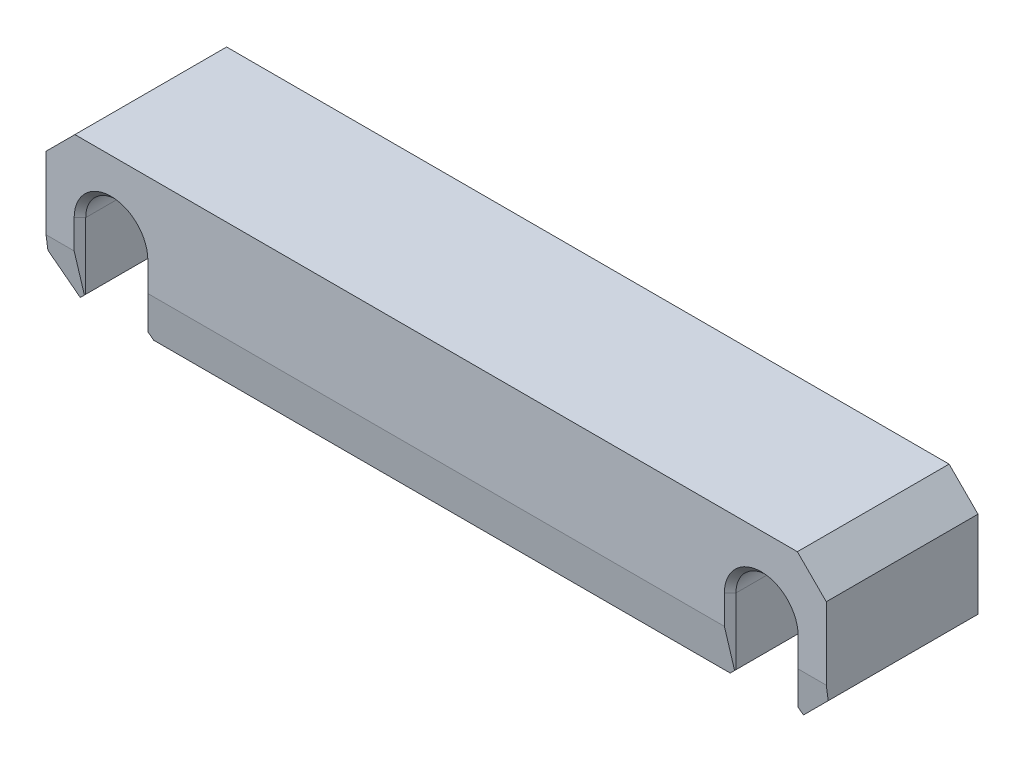
ISO-10303-21;
HEADER;
FILE_DESCRIPTION(('STEP AP214'),'2;1');
FILE_NAME('part.step','',(''),(''),'','','');
FILE_SCHEMA(('AUTOMOTIVE_DESIGN { 1 0 10303 214 1 1 1 1 }'));
ENDSEC;
DATA;
#1=APPLICATION_CONTEXT('core data for automotive mechanical design processes');
#2=APPLICATION_PROTOCOL_DEFINITION('international standard','automotive_design',2000,#1);
#3=PRODUCT_CONTEXT('',#1,'mechanical');
#4=PRODUCT('Part','Part','',(#3));
#5=PRODUCT_RELATED_PRODUCT_CATEGORY('part','',(#4));
#6=PRODUCT_DEFINITION_FORMATION('','',#4);
#7=PRODUCT_DEFINITION_CONTEXT('part definition',#1,'design');
#8=PRODUCT_DEFINITION('design','',#6,#7);
#9=PRODUCT_DEFINITION_SHAPE('','',#8);
#10=(LENGTH_UNIT() NAMED_UNIT(*) SI_UNIT(.MILLI.,.METRE.));
#11=(NAMED_UNIT(*) PLANE_ANGLE_UNIT() SI_UNIT($,.RADIAN.));
#12=(NAMED_UNIT(*) SI_UNIT($,.STERADIAN.) SOLID_ANGLE_UNIT());
#13=UNCERTAINTY_MEASURE_WITH_UNIT(LENGTH_MEASURE(1.E-05),#10,'distance_accuracy_value','');
#14=(GEOMETRIC_REPRESENTATION_CONTEXT(3) GLOBAL_UNCERTAINTY_ASSIGNED_CONTEXT((#13)) GLOBAL_UNIT_ASSIGNED_CONTEXT((#10,
#11,#12)) REPRESENTATION_CONTEXT('',''));
#15=CARTESIAN_POINT('',(0.,0.,0.));
#16=DIRECTION('',(0.,0.,1.));
#17=DIRECTION('',(1.,0.,0.));
#18=AXIS2_PLACEMENT_3D('',#15,#16,#17);
#19=CARTESIAN_POINT('',(0.,0.,10.5));
#20=DIRECTION('',(0.,1.,0.));
#21=DIRECTION('',(0.,0.,1.));
#22=AXIS2_PLACEMENT_3D('',#19,#20,#21);
#23=PLANE('',#22);
#24=DIRECTION('',(1.,0.,0.));
#25=VECTOR('',#24,1.);
#26=CARTESIAN_POINT('',(0.,0.,0.));
#27=LINE('',#26,#25);
#28=CARTESIAN_POINT('',(7.04999999999997,0.,0.));
#29=VERTEX_POINT('',#28);
#30=CARTESIAN_POINT('',(46.95,0.,0.));
#31=VERTEX_POINT('',#30);
#32=EDGE_CURVE('E259',#29,#31,#27,.T.);
#33=ORIENTED_EDGE('',*,*,#32,.T.);
#34=DIRECTION('',(0.,0.,1.));
#35=VECTOR('',#34,1.);
#36=CARTESIAN_POINT('',(46.95,0.,10.5));
#37=LINE('',#36,#35);
#38=CARTESIAN_POINT('',(46.95,0.,10.1));
#39=VERTEX_POINT('',#38);
#40=EDGE_CURVE('E418',#31,#39,#37,.T.);
#41=ORIENTED_EDGE('',*,*,#40,.T.);
#42=DIRECTION('',(-1.,0.,0.));
#43=VECTOR('',#42,1.);
#44=CARTESIAN_POINT('',(0.,0.,10.1));
#45=LINE('',#44,#43);
#46=CARTESIAN_POINT('',(7.05,0.,10.1));
#47=VERTEX_POINT('',#46);
#48=EDGE_CURVE('E239',#39,#47,#45,.T.);
#49=ORIENTED_EDGE('',*,*,#48,.T.);
#50=DIRECTION('',(0.,0.,-1.));
#51=VECTOR('',#50,1.);
#52=CARTESIAN_POINT('',(7.05,0.,10.5));
#53=LINE('',#52,#51);
#54=EDGE_CURVE('E416',#47,#29,#53,.T.);
#55=ORIENTED_EDGE('',*,*,#54,.T.);
#56=EDGE_LOOP('',(#33,#41,#49,#55));
#57=FACE_BOUND('',#56,.T.);
#58=ADVANCED_FACE('F32',(#57),#23,.F.);
#59=CARTESIAN_POINT('',(0.,0.,10.5));
#60=DIRECTION('',(1.,0.,0.));
#61=DIRECTION('',(0.,0.,-1.));
#62=AXIS2_PLACEMENT_3D('',#59,#60,#61);
#63=PLANE('',#62);
#64=DIRECTION('',(0.,-1.,0.));
#65=VECTOR('',#64,1.);
#66=CARTESIAN_POINT('',(0.,0.,0.));
#67=LINE('',#66,#65);
#68=CARTESIAN_POINT('',(0.,8.,0.));
#69=VERTEX_POINT('',#68);
#70=CARTESIAN_POINT('',(0.,2.00000000000001,0.));
#71=VERTEX_POINT('',#70);
#72=EDGE_CURVE('E256',#69,#71,#67,.T.);
#73=ORIENTED_EDGE('',*,*,#72,.T.);
#74=DIRECTION('',(0.,0.,1.));
#75=VECTOR('',#74,1.);
#76=CARTESIAN_POINT('',(0.,2.00000000000001,10.5));
#77=LINE('',#76,#75);
#78=CARTESIAN_POINT('',(0.,2.00000000000001,10.3666666666667));
#79=VERTEX_POINT('',#78);
#80=EDGE_CURVE('E299',#71,#79,#77,.T.);
#81=ORIENTED_EDGE('',*,*,#80,.T.);
#82=DIRECTION('',(0.,-0.991227900682635,-0.132163720091014));
#83=VECTOR('',#82,1.);
#84=CARTESIAN_POINT('',(0.,3.00000000000008,10.5));
#85=LINE('',#84,#83);
#86=CARTESIAN_POINT('',(0.,3.00000000000008,10.5));
#87=VERTEX_POINT('',#86);
#88=EDGE_CURVE('E240',#79,#87,#85,.F.);
#89=ORIENTED_EDGE('',*,*,#88,.T.);
#90=DIRECTION('',(0.,-1.,0.));
#91=VECTOR('',#90,1.);
#92=CARTESIAN_POINT('',(0.,0.,10.5));
#93=LINE('',#92,#91);
#94=CARTESIAN_POINT('',(0.,8.,10.5));
#95=VERTEX_POINT('',#94);
#96=EDGE_CURVE('E247',#95,#87,#93,.T.);
#97=ORIENTED_EDGE('',*,*,#96,.F.);
#98=DIRECTION('',(0.,0.,-1.));
#99=VECTOR('',#98,1.);
#100=CARTESIAN_POINT('',(0.,8.,10.5));
#101=LINE('',#100,#99);
#102=EDGE_CURVE('E296',#95,#69,#101,.T.);
#103=ORIENTED_EDGE('',*,*,#102,.T.);
#104=EDGE_LOOP('',(#73,#81,#89,#97,#103));
#105=FACE_BOUND('',#104,.T.);
#106=ADVANCED_FACE('F484',(#105),#63,.F.);
#107=CARTESIAN_POINT('',(54.,0.,10.5));
#108=DIRECTION('',(-1.,0.,0.));
#109=DIRECTION('',(0.,0.,1.));
#110=AXIS2_PLACEMENT_3D('',#107,#108,#109);
#111=PLANE('',#110);
#112=DIRECTION('',(0.,0.991227900682635,0.132163720091014));
#113=VECTOR('',#112,1.);
#114=CARTESIAN_POINT('',(54.,3.00000000000008,10.5));
#115=LINE('',#114,#113);
#116=CARTESIAN_POINT('',(54.,3.00000000000008,10.5));
#117=VERTEX_POINT('',#116);
#118=CARTESIAN_POINT('',(54.,2.,10.3666666666667));
#119=VERTEX_POINT('',#118);
#120=EDGE_CURVE('E232',#117,#119,#115,.F.);
#121=ORIENTED_EDGE('',*,*,#120,.T.);
#122=DIRECTION('',(0.,0.,-1.));
#123=VECTOR('',#122,1.);
#124=CARTESIAN_POINT('',(54.,2.,10.5));
#125=LINE('',#124,#123);
#126=CARTESIAN_POINT('',(54.,2.,0.));
#127=VERTEX_POINT('',#126);
#128=EDGE_CURVE('E275',#119,#127,#125,.T.);
#129=ORIENTED_EDGE('',*,*,#128,.T.);
#130=DIRECTION('',(0.,1.,0.));
#131=VECTOR('',#130,1.);
#132=CARTESIAN_POINT('',(54.,0.,0.));
#133=LINE('',#132,#131);
#134=CARTESIAN_POINT('',(54.,7.99999999999998,0.));
#135=VERTEX_POINT('',#134);
#136=EDGE_CURVE('E263',#127,#135,#133,.T.);
#137=ORIENTED_EDGE('',*,*,#136,.T.);
#138=DIRECTION('',(0.,0.,1.));
#139=VECTOR('',#138,1.);
#140=CARTESIAN_POINT('',(54.,7.99999999999998,10.5));
#141=LINE('',#140,#139);
#142=CARTESIAN_POINT('',(54.,7.99999999999998,10.5));
#143=VERTEX_POINT('',#142);
#144=EDGE_CURVE('E245',#135,#143,#141,.T.);
#145=ORIENTED_EDGE('',*,*,#144,.T.);
#146=DIRECTION('',(0.,1.,0.));
#147=VECTOR('',#146,1.);
#148=CARTESIAN_POINT('',(54.,0.,10.5));
#149=LINE('',#148,#147);
#150=EDGE_CURVE('E221',#117,#143,#149,.T.);
#151=ORIENTED_EDGE('',*,*,#150,.F.);
#152=EDGE_LOOP('',(#121,#129,#137,#145,#151));
#153=FACE_BOUND('',#152,.T.);
#154=ADVANCED_FACE('F242',(#153),#111,.F.);
#155=CARTESIAN_POINT('',(0.,10.,10.5));
#156=DIRECTION('',(0.,-1.,0.));
#157=DIRECTION('',(0.,0.,-1.));
#158=AXIS2_PLACEMENT_3D('',#155,#156,#157);
#159=PLANE('',#158);
#160=DIRECTION('',(-1.,0.,0.));
#161=VECTOR('',#160,1.);
#162=CARTESIAN_POINT('',(0.,10.,10.5));
#163=LINE('',#162,#161);
#164=CARTESIAN_POINT('',(52.,10.,10.5));
#165=VERTEX_POINT('',#164);
#166=CARTESIAN_POINT('',(2.00000000000001,10.,10.5));
#167=VERTEX_POINT('',#166);
#168=EDGE_CURVE('E246',#165,#167,#163,.T.);
#169=ORIENTED_EDGE('',*,*,#168,.F.);
#170=DIRECTION('',(0.,0.,-1.));
#171=VECTOR('',#170,1.);
#172=CARTESIAN_POINT('',(52.,10.,10.5));
#173=LINE('',#172,#171);
#174=CARTESIAN_POINT('',(52.,10.,0.));
#175=VERTEX_POINT('',#174);
#176=EDGE_CURVE('E289',#165,#175,#173,.T.);
#177=ORIENTED_EDGE('',*,*,#176,.T.);
#178=DIRECTION('',(-1.,0.,0.));
#179=VECTOR('',#178,1.);
#180=CARTESIAN_POINT('',(0.,10.,0.));
#181=LINE('',#180,#179);
#182=CARTESIAN_POINT('',(2.00000000000001,10.,0.));
#183=VERTEX_POINT('',#182);
#184=EDGE_CURVE('E252',#175,#183,#181,.T.);
#185=ORIENTED_EDGE('',*,*,#184,.T.);
#186=DIRECTION('',(0.,0.,1.));
#187=VECTOR('',#186,1.);
#188=CARTESIAN_POINT('',(2.00000000000001,10.,10.5));
#189=LINE('',#188,#187);
#190=EDGE_CURVE('E287',#183,#167,#189,.T.);
#191=ORIENTED_EDGE('',*,*,#190,.T.);
#192=EDGE_LOOP('',(#169,#177,#185,#191));
#193=FACE_BOUND('',#192,.T.);
#194=ADVANCED_FACE('F492',(#193),#159,.F.);
#195=CARTESIAN_POINT('',(0.,0.,10.5));
#196=DIRECTION('',(0.,0.,-1.));
#197=DIRECTION('',(-1.,0.,0.));
#198=AXIS2_PLACEMENT_3D('',#195,#196,#197);
#199=PLANE('',#198);
#200=CARTESIAN_POINT('',(49.5,5.,10.5));
#201=DIRECTION('',(0.,0.,-1.));
#202=DIRECTION('',(-1.,0.,0.));
#203=AXIS2_PLACEMENT_3D('',#200,#201,#202);
#204=CIRCLE('',#203,2.55000000000004);
#205=CARTESIAN_POINT('',(46.95,5.,10.5));
#206=VERTEX_POINT('',#205);
#207=CARTESIAN_POINT('',(52.05,5.,10.5));
#208=VERTEX_POINT('',#207);
#209=EDGE_CURVE('E341',#206,#208,#204,.T.);
#210=ORIENTED_EDGE('',*,*,#209,.T.);
#211=DIRECTION('',(0.,-1.,0.));
#212=VECTOR('',#211,1.);
#213=CARTESIAN_POINT('',(52.05,0.,10.5));
#214=LINE('',#213,#212);
#215=CARTESIAN_POINT('',(52.05,3.00000000000008,10.5));
#216=VERTEX_POINT('',#215);
#217=EDGE_CURVE('E224',#208,#216,#214,.T.);
#218=ORIENTED_EDGE('',*,*,#217,.T.);
#219=DIRECTION('',(1.,0.,0.));
#220=VECTOR('',#219,1.);
#221=CARTESIAN_POINT('',(0.,3.00000000000008,10.5));
#222=LINE('',#221,#220);
#223=EDGE_CURVE('E217',#216,#117,#222,.T.);
#224=ORIENTED_EDGE('',*,*,#223,.T.);
#225=ORIENTED_EDGE('',*,*,#150,.T.);
#226=DIRECTION('',(0.707106781186545,-0.70710678118655,0.));
#227=VECTOR('',#226,1.);
#228=CARTESIAN_POINT('',(52.,10.,10.5));
#229=LINE('',#228,#227);
#230=EDGE_CURVE('E294',#143,#165,#229,.F.);
#231=ORIENTED_EDGE('',*,*,#230,.T.);
#232=ORIENTED_EDGE('',*,*,#168,.T.);
#233=DIRECTION('',(0.70710678118655,0.707106781186545,0.));
#234=VECTOR('',#233,1.);
#235=CARTESIAN_POINT('',(0.,8.,10.5));
#236=LINE('',#235,#234);
#237=EDGE_CURVE('E292',#167,#95,#236,.F.);
#238=ORIENTED_EDGE('',*,*,#237,.T.);
#239=ORIENTED_EDGE('',*,*,#96,.T.);
#240=DIRECTION('',(1.,0.,0.));
#241=VECTOR('',#240,1.);
#242=CARTESIAN_POINT('',(0.,3.00000000000008,10.5));
#243=LINE('',#242,#241);
#244=CARTESIAN_POINT('',(1.94999999999996,3.00000000000008,10.5));
#245=VERTEX_POINT('',#244);
#246=EDGE_CURVE('E228',#87,#245,#243,.T.);
#247=ORIENTED_EDGE('',*,*,#246,.T.);
#248=DIRECTION('',(0.,1.,0.));
#249=VECTOR('',#248,1.);
#250=CARTESIAN_POINT('',(1.94999999999996,0.,10.5));
#251=LINE('',#250,#249);
#252=CARTESIAN_POINT('',(1.94999999999996,5.,10.5));
#253=VERTEX_POINT('',#252);
#254=EDGE_CURVE('E337',#245,#253,#251,.T.);
#255=ORIENTED_EDGE('',*,*,#254,.T.);
#256=CARTESIAN_POINT('',(4.5,5.,10.5));
#257=DIRECTION('',(0.,0.,-1.));
#258=DIRECTION('',(-1.,0.,0.));
#259=AXIS2_PLACEMENT_3D('',#256,#257,#258);
#260=CIRCLE('',#259,2.55000000000004);
#261=CARTESIAN_POINT('',(7.05000000000004,5.,10.5));
#262=VERTEX_POINT('',#261);
#263=EDGE_CURVE('E335',#253,#262,#260,.T.);
#264=ORIENTED_EDGE('',*,*,#263,.T.);
#265=DIRECTION('',(0.,-1.,0.));
#266=VECTOR('',#265,1.);
#267=CARTESIAN_POINT('',(7.05000000000004,0.,10.5));
#268=LINE('',#267,#266);
#269=CARTESIAN_POINT('',(7.05000000000004,3.00000000000008,10.5));
#270=VERTEX_POINT('',#269);
#271=EDGE_CURVE('E339',#262,#270,#268,.T.);
#272=ORIENTED_EDGE('',*,*,#271,.T.);
#273=DIRECTION('',(1.,0.,0.));
#274=VECTOR('',#273,1.);
#275=CARTESIAN_POINT('',(0.,3.00000000000008,10.5));
#276=LINE('',#275,#274);
#277=CARTESIAN_POINT('',(46.95,3.00000000000008,10.5));
#278=VERTEX_POINT('',#277);
#279=EDGE_CURVE('E229',#270,#278,#276,.T.);
#280=ORIENTED_EDGE('',*,*,#279,.T.);
#281=DIRECTION('',(0.,1.,0.));
#282=VECTOR('',#281,1.);
#283=CARTESIAN_POINT('',(46.95,0.,10.5));
#284=LINE('',#283,#282);
#285=EDGE_CURVE('E343',#278,#206,#284,.T.);
#286=ORIENTED_EDGE('',*,*,#285,.T.);
#287=EDGE_LOOP('',(#210,#218,#224,#225,#231,#232,#238,#239,#247,#255,#264,#272,#280,#286));
#288=FACE_BOUND('',#287,.T.);
#289=ADVANCED_FACE('F219',(#288),#199,.F.);
#290=CARTESIAN_POINT('',(0.,0.,0.));
#291=DIRECTION('',(0.,0.,-1.));
#292=DIRECTION('',(-1.,0.,0.));
#293=AXIS2_PLACEMENT_3D('',#290,#291,#292);
#294=PLANE('',#293);
#295=DIRECTION('',(0.70710678118655,0.707106781186545,0.));
#296=VECTOR('',#295,1.);
#297=CARTESIAN_POINT('',(25.9999999999998,-26.,0.));
#298=LINE('',#297,#296);
#299=CARTESIAN_POINT('',(52.05,0.0499999999999876,0.));
#300=VERTEX_POINT('',#299);
#301=EDGE_CURVE('E283',#127,#300,#298,.F.);
#302=ORIENTED_EDGE('',*,*,#301,.T.);
#303=DIRECTION('',(0.,1.,0.));
#304=VECTOR('',#303,1.);
#305=CARTESIAN_POINT('',(52.05,5.,0.));
#306=LINE('',#305,#304);
#307=CARTESIAN_POINT('',(52.05,5.,0.));
#308=VERTEX_POINT('',#307);
#309=EDGE_CURVE('E316',#300,#308,#306,.T.);
#310=ORIENTED_EDGE('',*,*,#309,.T.);
#311=CARTESIAN_POINT('',(49.5,5.,0.));
#312=DIRECTION('',(0.,0.,-1.));
#313=DIRECTION('',(-1.,0.,0.));
#314=AXIS2_PLACEMENT_3D('',#311,#312,#313);
#315=CIRCLE('',#314,2.54999999999997);
#316=CARTESIAN_POINT('',(46.95,5.,0.));
#317=VERTEX_POINT('',#316);
#318=EDGE_CURVE('E311',#308,#317,#315,.F.);
#319=ORIENTED_EDGE('',*,*,#318,.T.);
#320=DIRECTION('',(0.,-1.,0.));
#321=VECTOR('',#320,1.);
#322=CARTESIAN_POINT('',(46.95,0.,0.));
#323=LINE('',#322,#321);
#324=EDGE_CURVE('E313',#317,#31,#323,.T.);
#325=ORIENTED_EDGE('',*,*,#324,.T.);
#326=ORIENTED_EDGE('',*,*,#32,.F.);
#327=DIRECTION('',(0.,1.,0.));
#328=VECTOR('',#327,1.);
#329=CARTESIAN_POINT('',(7.04999999999997,5.,0.));
#330=LINE('',#329,#328);
#331=CARTESIAN_POINT('',(7.04999999999997,5.,0.));
#332=VERTEX_POINT('',#331);
#333=EDGE_CURVE('E308',#29,#332,#330,.T.);
#334=ORIENTED_EDGE('',*,*,#333,.T.);
#335=CARTESIAN_POINT('',(4.5,5.,0.));
#336=DIRECTION('',(0.,0.,-1.));
#337=DIRECTION('',(-1.,0.,0.));
#338=AXIS2_PLACEMENT_3D('',#335,#336,#337);
#339=CIRCLE('',#338,2.54999999999997);
#340=CARTESIAN_POINT('',(1.95000000000003,5.,0.));
#341=VERTEX_POINT('',#340);
#342=EDGE_CURVE('E304',#332,#341,#339,.F.);
#343=ORIENTED_EDGE('',*,*,#342,.T.);
#344=DIRECTION('',(0.,-1.,0.));
#345=VECTOR('',#344,1.);
#346=CARTESIAN_POINT('',(1.95000000000003,0.,0.));
#347=LINE('',#346,#345);
#348=CARTESIAN_POINT('',(1.95000000000003,0.0499999999999687,0.));
#349=VERTEX_POINT('',#348);
#350=EDGE_CURVE('E306',#341,#349,#347,.T.);
#351=ORIENTED_EDGE('',*,*,#350,.T.);
#352=DIRECTION('',(0.707106781186545,-0.70710678118655,0.));
#353=VECTOR('',#352,1.);
#354=CARTESIAN_POINT('',(1.00000000000001,1.,0.));
#355=LINE('',#354,#353);
#356=EDGE_CURVE('E279',#349,#71,#355,.F.);
#357=ORIENTED_EDGE('',*,*,#356,.T.);
#358=ORIENTED_EDGE('',*,*,#72,.F.);
#359=DIRECTION('',(-0.70710678118655,-0.707106781186545,0.));
#360=VECTOR('',#359,1.);
#361=CARTESIAN_POINT('',(-4.,4.00000000000002,0.));
#362=LINE('',#361,#360);
#363=EDGE_CURVE('E277',#69,#183,#362,.F.);
#364=ORIENTED_EDGE('',*,*,#363,.T.);
#365=ORIENTED_EDGE('',*,*,#184,.F.);
#366=DIRECTION('',(-0.707106781186545,0.70710678118655,0.));
#367=VECTOR('',#366,1.);
#368=CARTESIAN_POINT('',(31.0000000000002,31.,0.));
#369=LINE('',#368,#367);
#370=EDGE_CURVE('E281',#175,#135,#369,.F.);
#371=ORIENTED_EDGE('',*,*,#370,.T.);
#372=ORIENTED_EDGE('',*,*,#136,.F.);
#373=EDGE_LOOP('',(#302,#310,#319,#325,#326,#334,#343,#351,#357,#358,#364,#365,#371,#372));
#374=FACE_BOUND('',#373,.T.);
#375=ADVANCED_FACE('F446',(#374),#294,.T.);
#376=CARTESIAN_POINT('',(49.5,5.,0.));
#377=DIRECTION('',(0.,0.,1.));
#378=DIRECTION('',(1.,0.,0.));
#379=AXIS2_PLACEMENT_3D('',#376,#377,#378);
#380=CYLINDRICAL_SURFACE('',#379,2.15);
#381=DIRECTION('',(0.,0.,1.));
#382=VECTOR('',#381,1.);
#383=CARTESIAN_POINT('',(47.35,5.,0.));
#384=LINE('',#383,#382);
#385=CARTESIAN_POINT('',(47.35,5.,0.39999999999997));
#386=VERTEX_POINT('',#385);
#387=CARTESIAN_POINT('',(47.35,5.,10.1));
#388=VERTEX_POINT('',#387);
#389=EDGE_CURVE('E541',#386,#388,#384,.T.);
#390=ORIENTED_EDGE('',*,*,#389,.F.);
#391=CARTESIAN_POINT('',(49.5,5.,0.39999999999997));
#392=DIRECTION('',(0.,0.,-1.));
#393=DIRECTION('',(-1.,0.,0.));
#394=AXIS2_PLACEMENT_3D('',#391,#392,#393);
#395=CIRCLE('',#394,2.15);
#396=CARTESIAN_POINT('',(51.65,5.,0.39999999999997));
#397=VERTEX_POINT('',#396);
#398=EDGE_CURVE('E333',#386,#397,#395,.T.);
#399=ORIENTED_EDGE('',*,*,#398,.T.);
#400=DIRECTION('',(0.,0.,1.));
#401=VECTOR('',#400,1.);
#402=CARTESIAN_POINT('',(51.65,5.,0.));
#403=LINE('',#402,#401);
#404=CARTESIAN_POINT('',(51.65,5.,10.1));
#405=VERTEX_POINT('',#404);
#406=EDGE_CURVE('E378',#397,#405,#403,.T.);
#407=ORIENTED_EDGE('',*,*,#406,.T.);
#408=CARTESIAN_POINT('',(49.5,5.,10.1));
#409=DIRECTION('',(0.,0.,-1.));
#410=DIRECTION('',(-1.,0.,0.));
#411=AXIS2_PLACEMENT_3D('',#408,#409,#410);
#412=CIRCLE('',#411,2.15);
#413=EDGE_CURVE('E331',#405,#388,#412,.F.);
#414=ORIENTED_EDGE('',*,*,#413,.T.);
#415=EDGE_LOOP('',(#390,#399,#407,#414));
#416=FACE_BOUND('',#415,.T.);
#417=ADVANCED_FACE('F550',(#416),#380,.F.);
#418=CARTESIAN_POINT('',(4.5,5.,0.));
#419=DIRECTION('',(0.,0.,1.));
#420=DIRECTION('',(1.,0.,0.));
#421=AXIS2_PLACEMENT_3D('',#418,#419,#420);
#422=CYLINDRICAL_SURFACE('',#421,2.15);
#423=DIRECTION('',(0.,0.,1.));
#424=VECTOR('',#423,1.);
#425=CARTESIAN_POINT('',(2.35,5.,0.));
#426=LINE('',#425,#424);
#427=CARTESIAN_POINT('',(2.35,5.,0.399999999999971));
#428=VERTEX_POINT('',#427);
#429=CARTESIAN_POINT('',(2.35,5.,10.1));
#430=VERTEX_POINT('',#429);
#431=EDGE_CURVE('E260',#428,#430,#426,.T.);
#432=ORIENTED_EDGE('',*,*,#431,.F.);
#433=CARTESIAN_POINT('',(4.5,5.,0.399999999999971));
#434=DIRECTION('',(0.,0.,-1.));
#435=DIRECTION('',(-1.,0.,0.));
#436=AXIS2_PLACEMENT_3D('',#433,#434,#435);
#437=CIRCLE('',#436,2.15);
#438=CARTESIAN_POINT('',(6.65,5.,0.399999999999971));
#439=VERTEX_POINT('',#438);
#440=EDGE_CURVE('E367',#428,#439,#437,.T.);
#441=ORIENTED_EDGE('',*,*,#440,.T.);
#442=DIRECTION('',(0.,0.,1.));
#443=VECTOR('',#442,1.);
#444=CARTESIAN_POINT('',(6.65,5.,0.));
#445=LINE('',#444,#443);
#446=CARTESIAN_POINT('',(6.65,5.,10.1));
#447=VERTEX_POINT('',#446);
#448=EDGE_CURVE('E538',#439,#447,#445,.T.);
#449=ORIENTED_EDGE('',*,*,#448,.T.);
#450=CARTESIAN_POINT('',(4.5,5.,10.1));
#451=DIRECTION('',(0.,0.,-1.));
#452=DIRECTION('',(-1.,0.,0.));
#453=AXIS2_PLACEMENT_3D('',#450,#451,#452);
#454=CIRCLE('',#453,2.15);
#455=EDGE_CURVE('E365',#447,#430,#454,.F.);
#456=ORIENTED_EDGE('',*,*,#455,.T.);
#457=EDGE_LOOP('',(#432,#441,#449,#456));
#458=FACE_BOUND('',#457,.T.);
#459=ADVANCED_FACE('F539',(#458),#422,.F.);
#460=CARTESIAN_POINT('',(6.65,5.,0.));
#461=DIRECTION('',(1.,0.,0.));
#462=DIRECTION('',(0.,0.,-1.));
#463=AXIS2_PLACEMENT_3D('',#460,#461,#462);
#464=PLANE('',#463);
#465=DIRECTION('',(0.,-1.,0.));
#466=VECTOR('',#465,1.);
#467=CARTESIAN_POINT('',(6.65,0.,0.399999999999971));
#468=LINE('',#467,#466);
#469=CARTESIAN_POINT('',(6.65,0.399999999999998,0.399999999999971));
#470=VERTEX_POINT('',#469);
#471=EDGE_CURVE('E355',#439,#470,#468,.T.);
#472=ORIENTED_EDGE('',*,*,#471,.T.);
#473=DIRECTION('',(0.,0.,1.));
#474=VECTOR('',#473,1.);
#475=CARTESIAN_POINT('',(6.65,0.399999999999998,0.));
#476=LINE('',#475,#474);
#477=CARTESIAN_POINT('',(6.65,0.399999999999998,10.1));
#478=VERTEX_POINT('',#477);
#479=EDGE_CURVE('E431',#470,#478,#476,.T.);
#480=ORIENTED_EDGE('',*,*,#479,.T.);
#481=DIRECTION('',(0.,1.,0.));
#482=VECTOR('',#481,1.);
#483=CARTESIAN_POINT('',(6.65,5.,10.1));
#484=LINE('',#483,#482);
#485=EDGE_CURVE('E353',#478,#447,#484,.T.);
#486=ORIENTED_EDGE('',*,*,#485,.T.);
#487=ORIENTED_EDGE('',*,*,#448,.F.);
#488=EDGE_LOOP('',(#472,#480,#486,#487));
#489=FACE_BOUND('',#488,.T.);
#490=ADVANCED_FACE('F727',(#489),#464,.F.);
#491=CARTESIAN_POINT('',(2.35,5.,0.));
#492=DIRECTION('',(-1.,0.,0.));
#493=DIRECTION('',(0.,-1.,0.));
#494=AXIS2_PLACEMENT_3D('',#491,#492,#493);
#495=PLANE('',#494);
#496=DIRECTION('',(0.,-1.,0.));
#497=VECTOR('',#496,1.);
#498=CARTESIAN_POINT('',(2.35,5.,10.1));
#499=LINE('',#498,#497);
#500=CARTESIAN_POINT('',(2.35,0.400000000000004,10.1));
#501=VERTEX_POINT('',#500);
#502=EDGE_CURVE('E360',#430,#501,#499,.T.);
#503=ORIENTED_EDGE('',*,*,#502,.T.);
#504=DIRECTION('',(0.,0.,-1.));
#505=VECTOR('',#504,1.);
#506=CARTESIAN_POINT('',(2.35,0.400000000000004,0.));
#507=LINE('',#506,#505);
#508=CARTESIAN_POINT('',(2.35,0.400000000000004,0.399999999999971));
#509=VERTEX_POINT('',#508);
#510=EDGE_CURVE('E411',#501,#509,#507,.T.);
#511=ORIENTED_EDGE('',*,*,#510,.T.);
#512=DIRECTION('',(0.,1.,0.));
#513=VECTOR('',#512,1.);
#514=CARTESIAN_POINT('',(2.35,5.,0.399999999999971));
#515=LINE('',#514,#513);
#516=EDGE_CURVE('E363',#509,#428,#515,.T.);
#517=ORIENTED_EDGE('',*,*,#516,.T.);
#518=ORIENTED_EDGE('',*,*,#431,.T.);
#519=EDGE_LOOP('',(#503,#511,#517,#518));
#520=FACE_BOUND('',#519,.T.);
#521=ADVANCED_FACE('F731',(#520),#495,.F.);
#522=CARTESIAN_POINT('',(51.65,5.,0.));
#523=DIRECTION('',(1.,0.,0.));
#524=DIRECTION('',(0.,0.,-1.));
#525=AXIS2_PLACEMENT_3D('',#522,#523,#524);
#526=PLANE('',#525);
#527=DIRECTION('',(0.,-1.,0.));
#528=VECTOR('',#527,1.);
#529=CARTESIAN_POINT('',(51.65,0.,0.39999999999997));
#530=LINE('',#529,#528);
#531=CARTESIAN_POINT('',(51.65,0.400000000000008,0.39999999999997));
#532=VERTEX_POINT('',#531);
#533=EDGE_CURVE('E321',#397,#532,#530,.T.);
#534=ORIENTED_EDGE('',*,*,#533,.T.);
#535=DIRECTION('',(0.,0.,1.));
#536=VECTOR('',#535,1.);
#537=CARTESIAN_POINT('',(51.65,0.400000000000008,0.));
#538=LINE('',#537,#536);
#539=CARTESIAN_POINT('',(51.65,0.400000000000008,10.1));
#540=VERTEX_POINT('',#539);
#541=EDGE_CURVE('E371',#532,#540,#538,.T.);
#542=ORIENTED_EDGE('',*,*,#541,.T.);
#543=DIRECTION('',(0.,1.,0.));
#544=VECTOR('',#543,1.);
#545=CARTESIAN_POINT('',(51.65,5.,10.1));
#546=LINE('',#545,#544);
#547=EDGE_CURVE('E319',#540,#405,#546,.T.);
#548=ORIENTED_EDGE('',*,*,#547,.T.);
#549=ORIENTED_EDGE('',*,*,#406,.F.);
#550=EDGE_LOOP('',(#534,#542,#548,#549));
#551=FACE_BOUND('',#550,.T.);
#552=ADVANCED_FACE('F553',(#551),#526,.F.);
#553=CARTESIAN_POINT('',(47.35,5.,0.));
#554=DIRECTION('',(-1.,0.,0.));
#555=DIRECTION('',(0.,0.,1.));
#556=AXIS2_PLACEMENT_3D('',#553,#554,#555);
#557=PLANE('',#556);
#558=DIRECTION('',(0.,-1.,0.));
#559=VECTOR('',#558,1.);
#560=CARTESIAN_POINT('',(47.35,5.,10.1));
#561=LINE('',#560,#559);
#562=CARTESIAN_POINT('',(47.35,0.399999999999992,10.1));
#563=VERTEX_POINT('',#562);
#564=EDGE_CURVE('E326',#388,#563,#561,.T.);
#565=ORIENTED_EDGE('',*,*,#564,.T.);
#566=DIRECTION('',(0.,0.,-1.));
#567=VECTOR('',#566,1.);
#568=CARTESIAN_POINT('',(47.35,0.399999999999992,0.));
#569=LINE('',#568,#567);
#570=CARTESIAN_POINT('',(47.35,0.399999999999992,0.39999999999997));
#571=VERTEX_POINT('',#570);
#572=EDGE_CURVE('E427',#563,#571,#569,.T.);
#573=ORIENTED_EDGE('',*,*,#572,.T.);
#574=DIRECTION('',(0.,1.,0.));
#575=VECTOR('',#574,1.);
#576=CARTESIAN_POINT('',(47.35,5.,0.39999999999997));
#577=LINE('',#576,#575);
#578=EDGE_CURVE('E329',#571,#386,#577,.T.);
#579=ORIENTED_EDGE('',*,*,#578,.T.);
#580=ORIENTED_EDGE('',*,*,#389,.T.);
#581=EDGE_LOOP('',(#565,#573,#579,#580));
#582=FACE_BOUND('',#581,.T.);
#583=ADVANCED_FACE('F580',(#582),#557,.F.);
#584=CARTESIAN_POINT('',(0.,3.00000000000008,10.5));
#585=DIRECTION('',(0.,0.132163720091014,-0.991227900682635));
#586=DIRECTION('',(1.,0.,0.));
#587=AXIS2_PLACEMENT_3D('',#584,#585,#586);
#588=PLANE('',#587);
#589=DIRECTION('',(0.703984881695896,-0.703984881695901,-0.093864650892784));
#590=VECTOR('',#589,1.);
#591=CARTESIAN_POINT('',(-0.504405286343648,2.50440528634367,10.4339207048458));
#592=LINE('',#591,#590);
#593=CARTESIAN_POINT('',(1.975,0.0250000000000029,10.1033333333333));
#594=VERTEX_POINT('',#593);
#595=EDGE_CURVE('E301',#79,#594,#592,.T.);
#596=ORIENTED_EDGE('',*,*,#595,.T.);
#597=DIRECTION('',(0.703984881695901,0.703984881695896,0.0938646508927833));
#598=VECTOR('',#597,1.);
#599=CARTESIAN_POINT('',(2.49680616740091,0.546806167400915,10.1729074889868));
#600=LINE('',#599,#598);
#601=CARTESIAN_POINT('',(2.30294117647056,0.352941176470561,10.1470588235294));
#602=VERTEX_POINT('',#601);
#603=EDGE_CURVE('E407',#594,#602,#600,.T.);
#604=ORIENTED_EDGE('',*,*,#603,.T.);
#605=DIRECTION('',(-0.131024356416081,0.982682673120629,0.13102435641608));
#606=VECTOR('',#605,1.);
#607=CARTESIAN_POINT('',(1.91652360515018,3.25107296137346,10.5334763948498));
#608=LINE('',#607,#606);
#609=EDGE_CURVE('E369',#602,#245,#608,.T.);
#610=ORIENTED_EDGE('',*,*,#609,.T.);
#611=ORIENTED_EDGE('',*,*,#246,.F.);
#612=ORIENTED_EDGE('',*,*,#88,.F.);
#613=EDGE_LOOP('',(#596,#604,#610,#611,#612));
#614=FACE_BOUND('',#613,.T.);
#615=ADVANCED_FACE('F473',(#614),#588,.F.);
#616=CARTESIAN_POINT('',(0.,3.00000000000008,10.5));
#617=DIRECTION('',(0.,0.132163720091014,-0.991227900682635));
#618=DIRECTION('',(1.,0.,0.));
#619=AXIS2_PLACEMENT_3D('',#616,#617,#618);
#620=PLANE('',#619);
#621=DIRECTION('',(-0.131024356416082,-0.982682673120628,-0.13102435641608));
#622=VECTOR('',#621,1.);
#623=CARTESIAN_POINT('',(51.1564377682404,-3.70171673819724,9.60643776824038));
#624=LINE('',#623,#622);
#625=CARTESIAN_POINT('',(51.6970588235294,0.352941176470555,10.1470588235294));
#626=VERTEX_POINT('',#625);
#627=EDGE_CURVE('E346',#216,#626,#624,.T.);
#628=ORIENTED_EDGE('',*,*,#627,.T.);
#629=DIRECTION('',(0.703984881695895,-0.703984881695901,-0.093864650892784));
#630=VECTOR('',#629,1.);
#631=CARTESIAN_POINT('',(24.7410792951544,27.3089207048459,13.7411894273127));
#632=LINE('',#631,#630);
#633=CARTESIAN_POINT('',(52.025,0.0250000000000096,10.1033333333333));
#634=VERTEX_POINT('',#633);
#635=EDGE_CURVE('E399',#626,#634,#632,.T.);
#636=ORIENTED_EDGE('',*,*,#635,.T.);
#637=DIRECTION('',(0.703984881695901,0.703984881695895,0.0938646508927833));
#638=VECTOR('',#637,1.);
#639=CARTESIAN_POINT('',(27.7422907488985,-24.2577092511013,6.86563876651993));
#640=LINE('',#639,#638);
#641=EDGE_CURVE('E235',#634,#119,#640,.T.);
#642=ORIENTED_EDGE('',*,*,#641,.T.);
#643=ORIENTED_EDGE('',*,*,#120,.F.);
#644=ORIENTED_EDGE('',*,*,#223,.F.);
#645=EDGE_LOOP('',(#628,#636,#642,#643,#644));
#646=FACE_BOUND('',#645,.T.);
#647=ADVANCED_FACE('F233',(#646),#620,.F.);
#648=CARTESIAN_POINT('',(0.,3.00000000000008,10.5));
#649=DIRECTION('',(0.,0.132163720091014,-0.991227900682635));
#650=DIRECTION('',(1.,0.,0.));
#651=AXIS2_PLACEMENT_3D('',#648,#649,#650);
#652=PLANE('',#651);
#653=ORIENTED_EDGE('',*,*,#48,.F.);
#654=DIRECTION('',(0.703984881695898,0.703984881695899,0.0938646508927838));
#655=VECTOR('',#654,1.);
#656=CARTESIAN_POINT('',(25.1950440528635,-21.7549559471365,7.19933920704855));
#657=LINE('',#656,#655);
#658=CARTESIAN_POINT('',(47.3029411764705,0.352941176470539,10.1470588235294));
#659=VERTEX_POINT('',#658);
#660=EDGE_CURVE('E423',#39,#659,#657,.T.);
#661=ORIENTED_EDGE('',*,*,#660,.T.);
#662=DIRECTION('',(-0.131024356416082,0.982682673120628,0.13102435641608));
#663=VECTOR('',#662,1.);
#664=CARTESIAN_POINT('',(46.143991416309,9.04506437768239,11.306008583691));
#665=LINE('',#664,#663);
#666=EDGE_CURVE('E351',#659,#278,#665,.T.);
#667=ORIENTED_EDGE('',*,*,#666,.T.);
#668=ORIENTED_EDGE('',*,*,#279,.F.);
#669=DIRECTION('',(-0.13102435641608,-0.982682673120629,-0.13102435641608));
#670=VECTOR('',#669,1.);
#671=CARTESIAN_POINT('',(6.92896995708159,2.09227467811169,10.3789699570816));
#672=LINE('',#671,#670);
#673=CARTESIAN_POINT('',(6.69705882352944,0.352941176470555,10.1470588235294));
#674=VERTEX_POINT('',#673);
#675=EDGE_CURVE('E348',#270,#674,#672,.T.);
#676=ORIENTED_EDGE('',*,*,#675,.T.);
#677=DIRECTION('',(0.703984881695898,-0.703984881695899,-0.0938646508927838));
#678=VECTOR('',#677,1.);
#679=CARTESIAN_POINT('',(2.04284140969159,5.00715859030842,10.7676211453744));
#680=LINE('',#679,#678);
#681=EDGE_CURVE('E421',#674,#47,#680,.T.);
#682=ORIENTED_EDGE('',*,*,#681,.T.);
#683=EDGE_LOOP('',(#653,#661,#667,#668,#676,#682));
#684=FACE_BOUND('',#683,.T.);
#685=ADVANCED_FACE('F440',(#684),#652,.F.);
#686=CARTESIAN_POINT('',(54.,2.,10.5));
#687=DIRECTION('',(-0.707106781186545,0.70710678118655,0.));
#688=DIRECTION('',(0.,0.,-1.));
#689=AXIS2_PLACEMENT_3D('',#686,#687,#688);
#690=PLANE('',#689);
#691=ORIENTED_EDGE('',*,*,#641,.F.);
#692=DIRECTION('',(0.,0.,-1.));
#693=VECTOR('',#692,1.);
#694=CARTESIAN_POINT('',(52.025,0.0250000000000081,10.5));
#695=LINE('',#694,#693);
#696=CARTESIAN_POINT('',(52.025,0.0250000000000064,0.0249999999999734));
#697=VERTEX_POINT('',#696);
#698=EDGE_CURVE('E401',#634,#697,#695,.T.);
#699=ORIENTED_EDGE('',*,*,#698,.T.);
#700=DIRECTION('',(-0.577350269189627,-0.577350269189623,0.577350269189627));
#701=VECTOR('',#700,1.);
#702=CARTESIAN_POINT('',(49.85,-2.15,2.2));
#703=LINE('',#702,#701);
#704=EDGE_CURVE('E324',#697,#300,#703,.F.);
#705=ORIENTED_EDGE('',*,*,#704,.T.);
#706=ORIENTED_EDGE('',*,*,#301,.F.);
#707=ORIENTED_EDGE('',*,*,#128,.F.);
#708=EDGE_LOOP('',(#691,#699,#705,#706,#707));
#709=FACE_BOUND('',#708,.T.);
#710=ADVANCED_FACE('F500',(#709),#690,.F.);
#711=CARTESIAN_POINT('',(52.,10.,10.5));
#712=DIRECTION('',(-0.70710678118655,-0.707106781186545,0.));
#713=DIRECTION('',(0.,0.,-1.));
#714=AXIS2_PLACEMENT_3D('',#711,#712,#713);
#715=PLANE('',#714);
#716=ORIENTED_EDGE('',*,*,#230,.F.);
#717=ORIENTED_EDGE('',*,*,#144,.F.);
#718=ORIENTED_EDGE('',*,*,#370,.F.);
#719=ORIENTED_EDGE('',*,*,#176,.F.);
#720=EDGE_LOOP('',(#716,#717,#718,#719));
#721=FACE_BOUND('',#720,.T.);
#722=ADVANCED_FACE('F497',(#721),#715,.F.);
#723=CARTESIAN_POINT('',(2.,0.,10.5));
#724=DIRECTION('',(0.70710678118655,0.707106781186545,0.));
#725=DIRECTION('',(0.,0.,-1.));
#726=AXIS2_PLACEMENT_3D('',#723,#724,#725);
#727=PLANE('',#726);
#728=DIRECTION('',(-0.577350269189623,0.577350269189627,-0.577350269189627));
#729=VECTOR('',#728,1.);
#730=CARTESIAN_POINT('',(5.48333333333334,-3.48333333333336,3.53333333333332));
#731=LINE('',#730,#729);
#732=CARTESIAN_POINT('',(1.975,0.0250000000000025,0.0249999999999652));
#733=VERTEX_POINT('',#732);
#734=EDGE_CURVE('E357',#349,#733,#731,.F.);
#735=ORIENTED_EDGE('',*,*,#734,.T.);
#736=DIRECTION('',(0.,0.,1.));
#737=VECTOR('',#736,1.);
#738=CARTESIAN_POINT('',(1.975,0.0250000000000035,10.5));
#739=LINE('',#738,#737);
#740=EDGE_CURVE('E405',#733,#594,#739,.T.);
#741=ORIENTED_EDGE('',*,*,#740,.T.);
#742=ORIENTED_EDGE('',*,*,#595,.F.);
#743=ORIENTED_EDGE('',*,*,#80,.F.);
#744=ORIENTED_EDGE('',*,*,#356,.F.);
#745=EDGE_LOOP('',(#735,#741,#742,#743,#744));
#746=FACE_BOUND('',#745,.T.);
#747=ADVANCED_FACE('F463',(#746),#727,.F.);
#748=CARTESIAN_POINT('',(0.,8.,10.5));
#749=DIRECTION('',(0.707106781186545,-0.70710678118655,0.));
#750=DIRECTION('',(0.,0.,-1.));
#751=AXIS2_PLACEMENT_3D('',#748,#749,#750);
#752=PLANE('',#751);
#753=ORIENTED_EDGE('',*,*,#237,.F.);
#754=ORIENTED_EDGE('',*,*,#190,.F.);
#755=ORIENTED_EDGE('',*,*,#363,.F.);
#756=ORIENTED_EDGE('',*,*,#102,.F.);
#757=EDGE_LOOP('',(#753,#754,#755,#756));
#758=FACE_BOUND('',#757,.T.);
#759=ADVANCED_FACE('F495',(#758),#752,.F.);
#760=CARTESIAN_POINT('',(46.95,0.,0.));
#761=DIRECTION('',(0.707106781186548,0.,-0.707106781186548));
#762=DIRECTION('',(0.,1.,0.));
#763=AXIS2_PLACEMENT_3D('',#760,#761,#762);
#764=PLANE('',#763);
#765=ORIENTED_EDGE('',*,*,#578,.F.);
#766=DIRECTION('',(0.577350269189625,0.577350269189627,0.577350269189625));
#767=VECTOR('',#766,1.);
#768=CARTESIAN_POINT('',(46.95,0.,0.));
#769=LINE('',#768,#767);
#770=EDGE_CURVE('E429',#571,#31,#769,.F.);
#771=ORIENTED_EDGE('',*,*,#770,.T.);
#772=ORIENTED_EDGE('',*,*,#324,.F.);
#773=DIRECTION('',(-0.707106781186548,0.,-0.707106781186548));
#774=VECTOR('',#773,1.);
#775=CARTESIAN_POINT('',(47.35,5.,0.39999999999997));
#776=LINE('',#775,#774);
#777=EDGE_CURVE('E374',#386,#317,#776,.T.);
#778=ORIENTED_EDGE('',*,*,#777,.F.);
#779=EDGE_LOOP('',(#765,#771,#772,#778));
#780=FACE_BOUND('',#779,.T.);
#781=ADVANCED_FACE('F516',(#780),#764,.T.);
#782=CARTESIAN_POINT('',(49.5,5.,0.));
#783=DIRECTION('',(0.,0.,-1.));
#784=DIRECTION('',(-1.,0.,0.));
#785=AXIS2_PLACEMENT_3D('',#782,#783,#784);
#786=CONICAL_SURFACE('',#785,2.54999999999997,0.785398163397446);
#787=ORIENTED_EDGE('',*,*,#777,.T.);
#788=ORIENTED_EDGE('',*,*,#318,.F.);
#789=DIRECTION('',(0.707106781186547,0.,-0.707106781186548));
#790=VECTOR('',#789,1.);
#791=CARTESIAN_POINT('',(51.65,5.,0.39999999999997));
#792=LINE('',#791,#790);
#793=EDGE_CURVE('E372',#397,#308,#792,.T.);
#794=ORIENTED_EDGE('',*,*,#793,.F.);
#795=ORIENTED_EDGE('',*,*,#398,.F.);
#796=EDGE_LOOP('',(#787,#788,#794,#795));
#797=FACE_BOUND('',#796,.T.);
#798=ADVANCED_FACE('F512',(#797),#786,.F.);
#799=CARTESIAN_POINT('',(52.05,0.,0.));
#800=DIRECTION('',(-0.707106781186548,0.,-0.707106781186548));
#801=DIRECTION('',(0.,-1.,0.));
#802=AXIS2_PLACEMENT_3D('',#799,#800,#801);
#803=PLANE('',#802);
#804=ORIENTED_EDGE('',*,*,#704,.F.);
#805=DIRECTION('',(0.577350269189624,-0.577350269189629,-0.577350269189624));
#806=VECTOR('',#805,1.);
#807=CARTESIAN_POINT('',(52.05,0.,0.));
#808=LINE('',#807,#806);
#809=EDGE_CURVE('E403',#697,#532,#808,.F.);
#810=ORIENTED_EDGE('',*,*,#809,.T.);
#811=ORIENTED_EDGE('',*,*,#533,.F.);
#812=ORIENTED_EDGE('',*,*,#793,.T.);
#813=ORIENTED_EDGE('',*,*,#309,.F.);
#814=EDGE_LOOP('',(#804,#810,#811,#812,#813));
#815=FACE_BOUND('',#814,.T.);
#816=ADVANCED_FACE('F505',(#815),#803,.T.);
#817=CARTESIAN_POINT('',(47.35,5.,10.1));
#818=DIRECTION('',(-0.707106781186543,0.,-0.707106781186552));
#819=DIRECTION('',(0.,-1.,0.));
#820=AXIS2_PLACEMENT_3D('',#817,#818,#819);
#821=PLANE('',#820);
#822=ORIENTED_EDGE('',*,*,#666,.F.);
#823=DIRECTION('',(0.577350269189628,0.577350269189629,-0.57735026918962));
#824=VECTOR('',#823,1.);
#825=CARTESIAN_POINT('',(48.8833333333333,1.93333333333335,8.56666666666664));
#826=LINE('',#825,#824);
#827=EDGE_CURVE('E425',#659,#563,#826,.T.);
#828=ORIENTED_EDGE('',*,*,#827,.T.);
#829=ORIENTED_EDGE('',*,*,#564,.F.);
#830=DIRECTION('',(0.707106781186552,0.,-0.707106781186543));
#831=VECTOR('',#830,1.);
#832=CARTESIAN_POINT('',(46.95,5.,10.5));
#833=LINE('',#832,#831);
#834=EDGE_CURVE('E375',#206,#388,#833,.T.);
#835=ORIENTED_EDGE('',*,*,#834,.F.);
#836=ORIENTED_EDGE('',*,*,#285,.F.);
#837=EDGE_LOOP('',(#822,#828,#829,#835,#836));
#838=FACE_BOUND('',#837,.T.);
#839=ADVANCED_FACE('F525',(#838),#821,.F.);
#840=CARTESIAN_POINT('',(49.5,5.,10.1));
#841=DIRECTION('',(0.,0.,1.));
#842=DIRECTION('',(1.,0.,0.));
#843=AXIS2_PLACEMENT_3D('',#840,#841,#842);
#844=CONICAL_SURFACE('',#843,2.15,0.785398163397452);
#845=ORIENTED_EDGE('',*,*,#834,.T.);
#846=ORIENTED_EDGE('',*,*,#413,.F.);
#847=DIRECTION('',(-0.707106781186552,0.,-0.707106781186543));
#848=VECTOR('',#847,1.);
#849=CARTESIAN_POINT('',(52.05,5.,10.5));
#850=LINE('',#849,#848);
#851=EDGE_CURVE('E379',#208,#405,#850,.T.);
#852=ORIENTED_EDGE('',*,*,#851,.F.);
#853=ORIENTED_EDGE('',*,*,#209,.F.);
#854=EDGE_LOOP('',(#845,#846,#852,#853));
#855=FACE_BOUND('',#854,.T.);
#856=ADVANCED_FACE('F560',(#855),#844,.F.);
#857=CARTESIAN_POINT('',(51.65,5.,10.1));
#858=DIRECTION('',(0.707106781186543,0.,-0.707106781186552));
#859=DIRECTION('',(0.,1.,0.));
#860=AXIS2_PLACEMENT_3D('',#857,#858,#859);
#861=PLANE('',#860);
#862=ORIENTED_EDGE('',*,*,#547,.F.);
#863=DIRECTION('',(0.577350269189627,-0.577350269189632,0.577350269189619));
#864=VECTOR('',#863,1.);
#865=CARTESIAN_POINT('',(50.1166666666666,1.93333333333337,8.56666666666664));
#866=LINE('',#865,#864);
#867=EDGE_CURVE('E397',#540,#626,#866,.T.);
#868=ORIENTED_EDGE('',*,*,#867,.T.);
#869=ORIENTED_EDGE('',*,*,#627,.F.);
#870=ORIENTED_EDGE('',*,*,#217,.F.);
#871=ORIENTED_EDGE('',*,*,#851,.T.);
#872=EDGE_LOOP('',(#862,#868,#869,#870,#871));
#873=FACE_BOUND('',#872,.T.);
#874=ADVANCED_FACE('F558',(#873),#861,.F.);
#875=CARTESIAN_POINT('',(1.95000000000003,0.,0.));
#876=DIRECTION('',(0.70710678118655,0.,-0.707106781186545));
#877=DIRECTION('',(0.,1.,0.));
#878=AXIS2_PLACEMENT_3D('',#875,#876,#877);
#879=PLANE('',#878);
#880=ORIENTED_EDGE('',*,*,#516,.F.);
#881=DIRECTION('',(0.577350269189626,0.577350269189622,0.57735026918963));
#882=VECTOR('',#881,1.);
#883=CARTESIAN_POINT('',(1.95000000000003,0.,0.));
#884=LINE('',#883,#882);
#885=EDGE_CURVE('E414',#509,#733,#884,.F.);
#886=ORIENTED_EDGE('',*,*,#885,.T.);
#887=ORIENTED_EDGE('',*,*,#734,.F.);
#888=ORIENTED_EDGE('',*,*,#350,.F.);
#889=DIRECTION('',(-0.707106781186545,0.,-0.70710678118655));
#890=VECTOR('',#889,1.);
#891=CARTESIAN_POINT('',(2.35,5.,0.399999999999971));
#892=LINE('',#891,#890);
#893=EDGE_CURVE('E382',#428,#341,#892,.T.);
#894=ORIENTED_EDGE('',*,*,#893,.F.);
#895=EDGE_LOOP('',(#880,#886,#887,#888,#894));
#896=FACE_BOUND('',#895,.T.);
#897=ADVANCED_FACE('F460',(#896),#879,.T.);
#898=CARTESIAN_POINT('',(4.5,5.,0.));
#899=DIRECTION('',(0.,0.,-1.));
#900=DIRECTION('',(-1.,0.,0.));
#901=AXIS2_PLACEMENT_3D('',#898,#899,#900);
#902=CONICAL_SURFACE('',#901,2.54999999999997,0.785398163397445);
#903=ORIENTED_EDGE('',*,*,#893,.T.);
#904=ORIENTED_EDGE('',*,*,#342,.F.);
#905=DIRECTION('',(0.707106781186545,0.,-0.70710678118655));
#906=VECTOR('',#905,1.);
#907=CARTESIAN_POINT('',(6.65,5.,0.399999999999971));
#908=LINE('',#907,#906);
#909=EDGE_CURVE('E385',#439,#332,#908,.T.);
#910=ORIENTED_EDGE('',*,*,#909,.F.);
#911=ORIENTED_EDGE('',*,*,#440,.F.);
#912=EDGE_LOOP('',(#903,#904,#910,#911));
#913=FACE_BOUND('',#912,.T.);
#914=ADVANCED_FACE('F453',(#913),#902,.F.);
#915=CARTESIAN_POINT('',(7.04999999999997,0.,0.));
#916=DIRECTION('',(-0.70710678118655,0.,-0.707106781186545));
#917=DIRECTION('',(0.,-1.,0.));
#918=AXIS2_PLACEMENT_3D('',#915,#916,#917);
#919=PLANE('',#918);
#920=ORIENTED_EDGE('',*,*,#333,.F.);
#921=DIRECTION('',(0.577350269189624,-0.577350269189626,-0.577350269189628));
#922=VECTOR('',#921,1.);
#923=CARTESIAN_POINT('',(7.04999999999997,0.,0.));
#924=LINE('',#923,#922);
#925=EDGE_CURVE('E11',#29,#470,#924,.F.);
#926=ORIENTED_EDGE('',*,*,#925,.T.);
#927=ORIENTED_EDGE('',*,*,#471,.F.);
#928=ORIENTED_EDGE('',*,*,#909,.T.);
#929=EDGE_LOOP('',(#920,#926,#927,#928));
#930=FACE_BOUND('',#929,.T.);
#931=ADVANCED_FACE('F448',(#930),#919,.T.);
#932=CARTESIAN_POINT('',(2.35,5.,10.1));
#933=DIRECTION('',(-0.707106781186546,0.,-0.707106781186549));
#934=DIRECTION('',(0.,-1.,0.));
#935=AXIS2_PLACEMENT_3D('',#932,#933,#934);
#936=PLANE('',#935);
#937=ORIENTED_EDGE('',*,*,#609,.F.);
#938=DIRECTION('',(0.577350269189628,0.577350269189624,-0.577350269189626));
#939=VECTOR('',#938,1.);
#940=CARTESIAN_POINT('',(3.88333333333333,1.93333333333332,8.56666666666664));
#941=LINE('',#940,#939);
#942=EDGE_CURVE('E409',#602,#501,#941,.T.);
#943=ORIENTED_EDGE('',*,*,#942,.T.);
#944=ORIENTED_EDGE('',*,*,#502,.F.);
#945=DIRECTION('',(0.707106781186549,0.,-0.707106781186546));
#946=VECTOR('',#945,1.);
#947=CARTESIAN_POINT('',(1.94999999999996,5.,10.5));
#948=LINE('',#947,#946);
#949=EDGE_CURVE('E387',#253,#430,#948,.T.);
#950=ORIENTED_EDGE('',*,*,#949,.F.);
#951=ORIENTED_EDGE('',*,*,#254,.F.);
#952=EDGE_LOOP('',(#937,#943,#944,#950,#951));
#953=FACE_BOUND('',#952,.T.);
#954=ADVANCED_FACE('F478',(#953),#936,.F.);
#955=CARTESIAN_POINT('',(4.5,5.,10.1));
#956=DIRECTION('',(0.,0.,1.));
#957=DIRECTION('',(1.,0.,0.));
#958=AXIS2_PLACEMENT_3D('',#955,#956,#957);
#959=CONICAL_SURFACE('',#958,2.15,0.78539816339745);
#960=ORIENTED_EDGE('',*,*,#949,.T.);
#961=ORIENTED_EDGE('',*,*,#455,.F.);
#962=DIRECTION('',(-0.707106781186549,0.,-0.707106781186546));
#963=VECTOR('',#962,1.);
#964=CARTESIAN_POINT('',(7.05000000000004,5.,10.5));
#965=LINE('',#964,#963);
#966=EDGE_CURVE('E390',#262,#447,#965,.T.);
#967=ORIENTED_EDGE('',*,*,#966,.F.);
#968=ORIENTED_EDGE('',*,*,#263,.F.);
#969=EDGE_LOOP('',(#960,#961,#967,#968));
#970=FACE_BOUND('',#969,.T.);
#971=ADVANCED_FACE('F532',(#970),#959,.F.);
#972=CARTESIAN_POINT('',(6.65,5.,10.1));
#973=DIRECTION('',(0.707106781186546,0.,-0.707106781186549));
#974=DIRECTION('',(0.,1.,0.));
#975=AXIS2_PLACEMENT_3D('',#972,#973,#974);
#976=PLANE('',#975);
#977=ORIENTED_EDGE('',*,*,#485,.F.);
#978=DIRECTION('',(0.577350269189626,-0.577350269189627,0.577350269189624));
#979=VECTOR('',#978,1.);
#980=CARTESIAN_POINT('',(5.11666666666666,1.93333333333334,8.56666666666663));
#981=LINE('',#980,#979);
#982=EDGE_CURVE('E40',#478,#674,#981,.T.);
#983=ORIENTED_EDGE('',*,*,#982,.T.);
#984=ORIENTED_EDGE('',*,*,#675,.F.);
#985=ORIENTED_EDGE('',*,*,#271,.F.);
#986=ORIENTED_EDGE('',*,*,#966,.T.);
#987=EDGE_LOOP('',(#977,#983,#984,#985,#986));
#988=FACE_BOUND('',#987,.T.);
#989=ADVANCED_FACE('F435',(#988),#976,.F.);
#990=CARTESIAN_POINT('',(51.65,0.400000000000008,0.));
#991=DIRECTION('',(0.707106781186551,0.707106781186544,0.));
#992=DIRECTION('',(0.,0.,1.));
#993=AXIS2_PLACEMENT_3D('',#990,#991,#992);
#994=PLANE('',#993);
#995=ORIENTED_EDGE('',*,*,#809,.F.);
#996=ORIENTED_EDGE('',*,*,#698,.F.);
#997=ORIENTED_EDGE('',*,*,#635,.F.);
#998=ORIENTED_EDGE('',*,*,#867,.F.);
#999=ORIENTED_EDGE('',*,*,#541,.F.);
#1000=EDGE_LOOP('',(#995,#996,#997,#998,#999));
#1001=FACE_BOUND('',#1000,.T.);
#1002=ADVANCED_FACE('F660',(#1001),#994,.F.);
#1003=CARTESIAN_POINT('',(1.94999999999999,0.,10.5));
#1004=DIRECTION('',(-0.707106781186545,0.70710678118655,0.));
#1005=DIRECTION('',(0.,0.,1.));
#1006=AXIS2_PLACEMENT_3D('',#1003,#1004,#1005);
#1007=PLANE('',#1006);
#1008=ORIENTED_EDGE('',*,*,#885,.F.);
#1009=ORIENTED_EDGE('',*,*,#510,.F.);
#1010=ORIENTED_EDGE('',*,*,#942,.F.);
#1011=ORIENTED_EDGE('',*,*,#603,.F.);
#1012=ORIENTED_EDGE('',*,*,#740,.F.);
#1013=EDGE_LOOP('',(#1008,#1009,#1010,#1011,#1012));
#1014=FACE_BOUND('',#1013,.T.);
#1015=ADVANCED_FACE('F468',(#1014),#1007,.F.);
#1016=CARTESIAN_POINT('',(46.95,0.,10.5));
#1017=DIRECTION('',(-0.707106781186548,0.707106781186547,0.));
#1018=DIRECTION('',(0.,0.,1.));
#1019=AXIS2_PLACEMENT_3D('',#1016,#1017,#1018);
#1020=PLANE('',#1019);
#1021=ORIENTED_EDGE('',*,*,#770,.F.);
#1022=ORIENTED_EDGE('',*,*,#572,.F.);
#1023=ORIENTED_EDGE('',*,*,#827,.F.);
#1024=ORIENTED_EDGE('',*,*,#660,.F.);
#1025=ORIENTED_EDGE('',*,*,#40,.F.);
#1026=EDGE_LOOP('',(#1021,#1022,#1023,#1024,#1025));
#1027=FACE_BOUND('',#1026,.T.);
#1028=ADVANCED_FACE('F520',(#1027),#1020,.F.);
#1029=CARTESIAN_POINT('',(6.65,0.399999999999998,0.));
#1030=DIRECTION('',(0.707106781186548,0.707106781186547,0.));
#1031=DIRECTION('',(0.,0.,1.));
#1032=AXIS2_PLACEMENT_3D('',#1029,#1030,#1031);
#1033=PLANE('',#1032);
#1034=ORIENTED_EDGE('',*,*,#925,.F.);
#1035=ORIENTED_EDGE('',*,*,#54,.F.);
#1036=ORIENTED_EDGE('',*,*,#681,.F.);
#1037=ORIENTED_EDGE('',*,*,#982,.F.);
#1038=ORIENTED_EDGE('',*,*,#479,.F.);
#1039=EDGE_LOOP('',(#1034,#1035,#1036,#1037,#1038));
#1040=FACE_BOUND('',#1039,.T.);
#1041=ADVANCED_FACE('F34',(#1040),#1033,.F.);
#1042=CLOSED_SHELL('',(#58,#106,#154,#194,#289,#375,#417,#459,#490,#521,#552,#583,#615,#647,
#685,#710,#722,#747,#759,#781,#798,#816,#839,#856,#874,#897,#914,#931,#954,#971,#989,#1002,
#1015,#1028,#1041));
#1043=MANIFOLD_SOLID_BREP('B2',#1042);
#1044=ADVANCED_BREP_SHAPE_REPRESENTATION('',(#18,#1043),#14);
#1045=SHAPE_DEFINITION_REPRESENTATION(#9,#1044);
ENDSEC;
END-ISO-10303-21;
